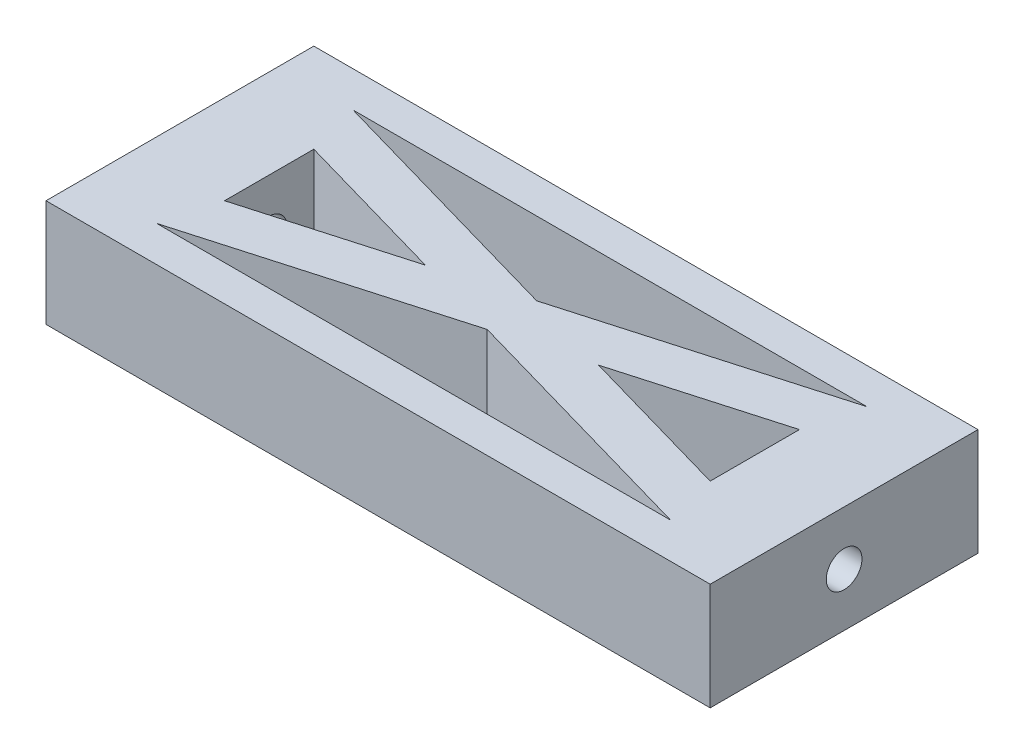
ISO-10303-21;
HEADER;
FILE_DESCRIPTION(('STEP AP214'),'2;1');
FILE_NAME('part.step','',(''),(''),'','','');
FILE_SCHEMA(('AUTOMOTIVE_DESIGN { 1 0 10303 214 1 1 1 1 }'));
ENDSEC;
DATA;
#1=APPLICATION_CONTEXT('core data for automotive mechanical design processes');
#2=APPLICATION_PROTOCOL_DEFINITION('international standard','automotive_design',2000,#1);
#3=PRODUCT_CONTEXT('',#1,'mechanical');
#4=PRODUCT('Part','Part','',(#3));
#5=PRODUCT_RELATED_PRODUCT_CATEGORY('part','',(#4));
#6=PRODUCT_DEFINITION_FORMATION('','',#4);
#7=PRODUCT_DEFINITION_CONTEXT('part definition',#1,'design');
#8=PRODUCT_DEFINITION('design','',#6,#7);
#9=PRODUCT_DEFINITION_SHAPE('','',#8);
#10=(LENGTH_UNIT() NAMED_UNIT(*) SI_UNIT(.MILLI.,.METRE.));
#11=(NAMED_UNIT(*) PLANE_ANGLE_UNIT() SI_UNIT($,.RADIAN.));
#12=(NAMED_UNIT(*) SI_UNIT($,.STERADIAN.) SOLID_ANGLE_UNIT());
#13=UNCERTAINTY_MEASURE_WITH_UNIT(LENGTH_MEASURE(1.E-05),#10,'distance_accuracy_value','');
#14=(GEOMETRIC_REPRESENTATION_CONTEXT(3) GLOBAL_UNCERTAINTY_ASSIGNED_CONTEXT((#13)) GLOBAL_UNIT_ASSIGNED_CONTEXT((#10,
#11,#12)) REPRESENTATION_CONTEXT('',''));
#15=CARTESIAN_POINT('',(0.,0.,0.));
#16=DIRECTION('',(0.,0.,1.));
#17=DIRECTION('',(1.,0.,0.));
#18=AXIS2_PLACEMENT_3D('',#15,#16,#17);
#19=CARTESIAN_POINT('',(0.,7.62,0.));
#20=DIRECTION('',(0.,1.,0.));
#21=DIRECTION('',(0.,0.,1.));
#22=AXIS2_PLACEMENT_3D('',#19,#20,#21);
#23=PLANE('',#22);
#24=DIRECTION('',(0.,0.,1.));
#25=VECTOR('',#24,1.);
#26=CARTESIAN_POINT('',(-23.622,7.62,9.52500000000001));
#27=LINE('',#26,#25);
#28=CARTESIAN_POINT('',(-23.622,7.62,-9.525));
#29=VERTEX_POINT('',#28);
#30=CARTESIAN_POINT('',(-23.622,7.62,9.52500000000001));
#31=VERTEX_POINT('',#30);
#32=EDGE_CURVE('E337',#29,#31,#27,.T.);
#33=ORIENTED_EDGE('',*,*,#32,.T.);
#34=DIRECTION('',(1.,0.,0.));
#35=VECTOR('',#34,1.);
#36=CARTESIAN_POINT('',(23.622,7.62,9.525));
#37=LINE('',#36,#35);
#38=CARTESIAN_POINT('',(23.622,7.62,9.525));
#39=VERTEX_POINT('',#38);
#40=EDGE_CURVE('E339',#31,#39,#37,.T.);
#41=ORIENTED_EDGE('',*,*,#40,.T.);
#42=DIRECTION('',(0.,0.,-1.));
#43=VECTOR('',#42,1.);
#44=CARTESIAN_POINT('',(23.622,7.62,9.525));
#45=LINE('',#44,#43);
#46=CARTESIAN_POINT('',(23.622,7.62,-9.525));
#47=VERTEX_POINT('',#46);
#48=EDGE_CURVE('E345',#39,#47,#45,.T.);
#49=ORIENTED_EDGE('',*,*,#48,.T.);
#50=DIRECTION('',(-1.,0.,0.));
#51=VECTOR('',#50,1.);
#52=CARTESIAN_POINT('',(23.622,7.62,-9.525));
#53=LINE('',#52,#51);
#54=EDGE_CURVE('E341',#47,#29,#53,.T.);
#55=ORIENTED_EDGE('',*,*,#54,.T.);
#56=EDGE_LOOP('',(#33,#41,#49,#55));
#57=FACE_BOUND('',#56,.T.);
#58=DIRECTION('',(-0.961474939175395,0.,-0.274892599641515));
#59=VECTOR('',#58,1.);
#60=CARTESIAN_POINT('',(-0.466014991757953,7.62,1.62995197557014));
#61=LINE('',#60,#59);
#62=CARTESIAN_POINT('',(-6.16699777053712,7.62,0.));
#63=VERTEX_POINT('',#62);
#64=CARTESIAN_POINT('',(-17.272,7.62,-3.17499999999999));
#65=VERTEX_POINT('',#64);
#66=EDGE_CURVE('E317',#63,#65,#61,.T.);
#67=ORIENTED_EDGE('',*,*,#66,.F.);
#68=DIRECTION('',(-0.961474939175395,0.,0.274892599641515));
#69=VECTOR('',#68,1.);
#70=CARTESIAN_POINT('',(-0.466014991757952,7.62,-1.62995197557014));
#71=LINE('',#70,#69);
#72=CARTESIAN_POINT('',(-17.272,7.62,3.175));
#73=VERTEX_POINT('',#72);
#74=EDGE_CURVE('E297',#63,#73,#71,.T.);
#75=ORIENTED_EDGE('',*,*,#74,.T.);
#76=DIRECTION('',(0.,0.,-1.));
#77=VECTOR('',#76,1.);
#78=CARTESIAN_POINT('',(-17.272,7.62,0.));
#79=LINE('',#78,#77);
#80=EDGE_CURVE('E310',#73,#65,#79,.T.);
#81=ORIENTED_EDGE('',*,*,#80,.T.);
#82=EDGE_LOOP('',(#67,#75,#81));
#83=FACE_BOUND('',#82,.T.);
#84=DIRECTION('',(-0.961474939175395,0.,0.274892599641515));
#85=VECTOR('',#84,1.);
#86=CARTESIAN_POINT('',(-0.466014991757952,7.62,-1.62995197557014));
#87=LINE('',#86,#85);
#88=CARTESIAN_POINT('',(18.2640071342813,7.62,-6.985));
#89=VERTEX_POINT('',#88);
#90=CARTESIAN_POINT('',(-0.00582880520858436,7.62,-1.76152251577389));
#91=VERTEX_POINT('',#90);
#92=EDGE_CURVE('E254',#89,#91,#87,.T.);
#93=ORIENTED_EDGE('',*,*,#92,.T.);
#94=DIRECTION('',(-0.961523947640823,0.,-0.274721127897378));
#95=VECTOR('',#94,1.);
#96=CARTESIAN_POINT('',(0.464867924528303,7.62,-1.62703773584906));
#97=LINE('',#96,#95);
#98=CARTESIAN_POINT('',(-18.288,7.62,-6.985));
#99=VERTEX_POINT('',#98);
#100=EDGE_CURVE('E246',#91,#99,#97,.T.);
#101=ORIENTED_EDGE('',*,*,#100,.T.);
#102=DIRECTION('',(1.,0.,0.));
#103=VECTOR('',#102,1.);
#104=CARTESIAN_POINT('',(0.,7.62,-6.985));
#105=LINE('',#104,#103);
#106=EDGE_CURVE('E249',#99,#89,#105,.T.);
#107=ORIENTED_EDGE('',*,*,#106,.T.);
#108=EDGE_LOOP('',(#93,#101,#107));
#109=FACE_BOUND('',#108,.T.);
#110=DIRECTION('',(-0.961523947640823,0.,-0.274721127897378));
#111=VECTOR('',#110,1.);
#112=CARTESIAN_POINT('',(0.464867924528303,7.62,-1.62703773584906));
#113=LINE('',#112,#111);
#114=CARTESIAN_POINT('',(17.272,7.62,3.175));
#115=VERTEX_POINT('',#114);
#116=CARTESIAN_POINT('',(6.15950000000002,7.62,0.));
#117=VERTEX_POINT('',#116);
#118=EDGE_CURVE('E291',#115,#117,#113,.T.);
#119=ORIENTED_EDGE('',*,*,#118,.T.);
#120=DIRECTION('',(0.961523947640823,0.,-0.274721127897378));
#121=VECTOR('',#120,1.);
#122=CARTESIAN_POINT('',(0.464867924528305,7.62,1.62703773584907));
#123=LINE('',#122,#121);
#124=CARTESIAN_POINT('',(17.272,7.62,-3.17499999999999));
#125=VERTEX_POINT('',#124);
#126=EDGE_CURVE('E132',#117,#125,#123,.T.);
#127=ORIENTED_EDGE('',*,*,#126,.T.);
#128=DIRECTION('',(0.,0.,1.));
#129=VECTOR('',#128,1.);
#130=CARTESIAN_POINT('',(17.272,7.62,0.));
#131=LINE('',#130,#129);
#132=EDGE_CURVE('E287',#125,#115,#131,.T.);
#133=ORIENTED_EDGE('',*,*,#132,.T.);
#134=EDGE_LOOP('',(#119,#127,#133));
#135=FACE_BOUND('',#134,.T.);
#136=DIRECTION('',(1.,0.,0.));
#137=VECTOR('',#136,1.);
#138=CARTESIAN_POINT('',(0.,7.62,6.98500000000001));
#139=LINE('',#138,#137);
#140=CARTESIAN_POINT('',(-18.288,7.62,6.985));
#141=VERTEX_POINT('',#140);
#142=CARTESIAN_POINT('',(18.2640071342813,7.62,6.98500000000001));
#143=VERTEX_POINT('',#142);
#144=EDGE_CURVE('E271',#141,#143,#139,.T.);
#145=ORIENTED_EDGE('',*,*,#144,.F.);
#146=DIRECTION('',(0.961523947640823,0.,-0.274721127897378));
#147=VECTOR('',#146,1.);
#148=CARTESIAN_POINT('',(0.464867924528305,7.62,1.62703773584907));
#149=LINE('',#148,#147);
#150=CARTESIAN_POINT('',(-0.00582880520857997,7.62,1.76152251577389));
#151=VERTEX_POINT('',#150);
#152=EDGE_CURVE('E130',#141,#151,#149,.T.);
#153=ORIENTED_EDGE('',*,*,#152,.T.);
#154=DIRECTION('',(-0.961474939175395,0.,-0.274892599641515));
#155=VECTOR('',#154,1.);
#156=CARTESIAN_POINT('',(-0.466014991757953,7.62,1.62995197557014));
#157=LINE('',#156,#155);
#158=EDGE_CURVE('E262',#143,#151,#157,.T.);
#159=ORIENTED_EDGE('',*,*,#158,.F.);
#160=EDGE_LOOP('',(#145,#153,#159));
#161=FACE_BOUND('',#160,.T.);
#162=ADVANCED_FACE('F109',(#57,#83,#109,#135,#161),#23,.T.);
#163=CARTESIAN_POINT('',(0.,0.,0.));
#164=DIRECTION('',(0.,1.,0.));
#165=DIRECTION('',(0.,0.,1.));
#166=AXIS2_PLACEMENT_3D('',#163,#164,#165);
#167=PLANE('',#166);
#168=DIRECTION('',(0.961523947640823,0.,-0.274721127897378));
#169=VECTOR('',#168,1.);
#170=CARTESIAN_POINT('',(0.464867924528305,0.,1.62703773584907));
#171=LINE('',#170,#169);
#172=CARTESIAN_POINT('',(6.15950000000002,0.,0.));
#173=VERTEX_POINT('',#172);
#174=CARTESIAN_POINT('',(17.272,0.,-3.17499999999999));
#175=VERTEX_POINT('',#174);
#176=EDGE_CURVE('E285',#173,#175,#171,.T.);
#177=ORIENTED_EDGE('',*,*,#176,.F.);
#178=DIRECTION('',(-0.961523947640823,0.,-0.274721127897378));
#179=VECTOR('',#178,1.);
#180=CARTESIAN_POINT('',(0.464867924528303,0.,-1.62703773584906));
#181=LINE('',#180,#179);
#182=CARTESIAN_POINT('',(17.272,0.,3.17499999999999));
#183=VERTEX_POINT('',#182);
#184=EDGE_CURVE('E282',#183,#173,#181,.T.);
#185=ORIENTED_EDGE('',*,*,#184,.F.);
#186=DIRECTION('',(0.,0.,1.));
#187=VECTOR('',#186,1.);
#188=CARTESIAN_POINT('',(17.272,0.,0.));
#189=LINE('',#188,#187);
#190=EDGE_CURVE('E288',#175,#183,#189,.T.);
#191=ORIENTED_EDGE('',*,*,#190,.F.);
#192=EDGE_LOOP('',(#177,#185,#191));
#193=FACE_BOUND('',#192,.T.);
#194=DIRECTION('',(-0.961474939175395,0.,0.274892599641515));
#195=VECTOR('',#194,1.);
#196=CARTESIAN_POINT('',(-0.466014991757952,0.,-1.62995197557014));
#197=LINE('',#196,#195);
#198=CARTESIAN_POINT('',(-6.16699777053712,0.,0.));
#199=VERTEX_POINT('',#198);
#200=CARTESIAN_POINT('',(-17.272,0.,3.175));
#201=VERTEX_POINT('',#200);
#202=EDGE_CURVE('E302',#199,#201,#197,.T.);
#203=ORIENTED_EDGE('',*,*,#202,.F.);
#204=DIRECTION('',(-0.961474939175395,0.,-0.274892599641515));
#205=VECTOR('',#204,1.);
#206=CARTESIAN_POINT('',(-0.466014991757953,0.,1.62995197557014));
#207=LINE('',#206,#205);
#208=CARTESIAN_POINT('',(-17.272,0.,-3.17499999999999));
#209=VERTEX_POINT('',#208);
#210=EDGE_CURVE('E306',#199,#209,#207,.T.);
#211=ORIENTED_EDGE('',*,*,#210,.T.);
#212=DIRECTION('',(0.,0.,-1.));
#213=VECTOR('',#212,1.);
#214=CARTESIAN_POINT('',(-17.272,0.,0.));
#215=LINE('',#214,#213);
#216=EDGE_CURVE('E309',#201,#209,#215,.T.);
#217=ORIENTED_EDGE('',*,*,#216,.F.);
#218=EDGE_LOOP('',(#203,#211,#217));
#219=FACE_BOUND('',#218,.T.);
#220=DIRECTION('',(0.,0.,1.));
#221=VECTOR('',#220,1.);
#222=CARTESIAN_POINT('',(-23.622,0.,9.52500000000001));
#223=LINE('',#222,#221);
#224=CARTESIAN_POINT('',(-23.622,0.,-9.525));
#225=VERTEX_POINT('',#224);
#226=CARTESIAN_POINT('',(-23.622,0.,9.52500000000001));
#227=VERTEX_POINT('',#226);
#228=EDGE_CURVE('E331',#225,#227,#223,.T.);
#229=ORIENTED_EDGE('',*,*,#228,.F.);
#230=DIRECTION('',(-1.,0.,0.));
#231=VECTOR('',#230,1.);
#232=CARTESIAN_POINT('',(23.622,0.,-9.525));
#233=LINE('',#232,#231);
#234=CARTESIAN_POINT('',(23.622,0.,-9.525));
#235=VERTEX_POINT('',#234);
#236=EDGE_CURVE('E338',#235,#225,#233,.T.);
#237=ORIENTED_EDGE('',*,*,#236,.F.);
#238=DIRECTION('',(0.,0.,-1.));
#239=VECTOR('',#238,1.);
#240=CARTESIAN_POINT('',(23.622,0.,9.525));
#241=LINE('',#240,#239);
#242=CARTESIAN_POINT('',(23.622,0.,9.525));
#243=VERTEX_POINT('',#242);
#244=EDGE_CURVE('E352',#243,#235,#241,.T.);
#245=ORIENTED_EDGE('',*,*,#244,.F.);
#246=DIRECTION('',(1.,0.,0.));
#247=VECTOR('',#246,1.);
#248=CARTESIAN_POINT('',(23.622,0.,9.525));
#249=LINE('',#248,#247);
#250=EDGE_CURVE('E348',#227,#243,#249,.T.);
#251=ORIENTED_EDGE('',*,*,#250,.F.);
#252=EDGE_LOOP('',(#229,#237,#245,#251));
#253=FACE_BOUND('',#252,.T.);
#254=DIRECTION('',(-0.961523947640823,0.,-0.274721127897378));
#255=VECTOR('',#254,1.);
#256=CARTESIAN_POINT('',(0.464867924528303,0.,-1.62703773584906));
#257=LINE('',#256,#255);
#258=CARTESIAN_POINT('',(-0.00582880520858442,0.,-1.76152251577389));
#259=VERTEX_POINT('',#258);
#260=CARTESIAN_POINT('',(-18.288,0.,-6.985));
#261=VERTEX_POINT('',#260);
#262=EDGE_CURVE('E237',#259,#261,#257,.T.);
#263=ORIENTED_EDGE('',*,*,#262,.F.);
#264=DIRECTION('',(-0.961474939175395,0.,0.274892599641515));
#265=VECTOR('',#264,1.);
#266=CARTESIAN_POINT('',(-0.466014991757952,0.,-1.62995197557014));
#267=LINE('',#266,#265);
#268=CARTESIAN_POINT('',(18.2640071342813,0.,-6.985));
#269=VERTEX_POINT('',#268);
#270=EDGE_CURVE('E227',#269,#259,#267,.T.);
#271=ORIENTED_EDGE('',*,*,#270,.F.);
#272=DIRECTION('',(1.,0.,0.));
#273=VECTOR('',#272,1.);
#274=CARTESIAN_POINT('',(0.,0.,-6.985));
#275=LINE('',#274,#273);
#276=EDGE_CURVE('E238',#261,#269,#275,.T.);
#277=ORIENTED_EDGE('',*,*,#276,.F.);
#278=EDGE_LOOP('',(#263,#271,#277));
#279=FACE_BOUND('',#278,.T.);
#280=DIRECTION('',(0.961523947640823,0.,-0.274721127897378));
#281=VECTOR('',#280,1.);
#282=CARTESIAN_POINT('',(0.464867924528305,0.,1.62703773584907));
#283=LINE('',#282,#281);
#284=CARTESIAN_POINT('',(-18.288,0.,6.98500000000002));
#285=VERTEX_POINT('',#284);
#286=CARTESIAN_POINT('',(-0.00582880520857997,0.,1.76152251577389));
#287=VERTEX_POINT('',#286);
#288=EDGE_CURVE('E261',#285,#287,#283,.T.);
#289=ORIENTED_EDGE('',*,*,#288,.F.);
#290=DIRECTION('',(1.,0.,0.));
#291=VECTOR('',#290,1.);
#292=CARTESIAN_POINT('',(0.,0.,6.98500000000001));
#293=LINE('',#292,#291);
#294=CARTESIAN_POINT('',(18.2640071342813,0.,6.98500000000001));
#295=VERTEX_POINT('',#294);
#296=EDGE_CURVE('E263',#285,#295,#293,.T.);
#297=ORIENTED_EDGE('',*,*,#296,.T.);
#298=DIRECTION('',(-0.961474939175395,0.,-0.274892599641515));
#299=VECTOR('',#298,1.);
#300=CARTESIAN_POINT('',(-0.466014991757953,0.,1.62995197557014));
#301=LINE('',#300,#299);
#302=EDGE_CURVE('E268',#295,#287,#301,.T.);
#303=ORIENTED_EDGE('',*,*,#302,.T.);
#304=EDGE_LOOP('',(#289,#297,#303));
#305=FACE_BOUND('',#304,.T.);
#306=ADVANCED_FACE('F247',(#193,#219,#253,#279,#305),#167,.F.);
#307=CARTESIAN_POINT('',(16.002,3.78692589120411,0.));
#308=DIRECTION('',(1.,0.,0.));
#309=DIRECTION('',(0.,0.,-1.));
#310=AXIS2_PLACEMENT_3D('',#307,#308,#309);
#311=CYLINDRICAL_SURFACE('',#310,1.27);
#312=CARTESIAN_POINT('',(23.622,3.78692589120411,0.));
#313=DIRECTION('',(1.,0.,0.));
#314=DIRECTION('',(0.,0.,-1.));
#315=AXIS2_PLACEMENT_3D('',#312,#313,#314);
#316=CIRCLE('',#315,1.27);
#317=CARTESIAN_POINT('',(23.622,3.78692589120411,-1.27));
#318=VERTEX_POINT('',#317);
#319=EDGE_CURVE('E335',#318,#318,#316,.T.);
#320=CARTESIAN_POINT('',(17.272,3.78692589120411,0.));
#321=DIRECTION('',(-1.,0.,0.));
#322=DIRECTION('',(0.,0.,1.));
#323=AXIS2_PLACEMENT_3D('',#320,#321,#322);
#324=CIRCLE('',#323,1.27);
#325=CARTESIAN_POINT('',(17.272,3.78692589120411,-1.27));
#326=VERTEX_POINT('',#325);
#327=EDGE_CURVE('E112',#326,#326,#324,.F.);
#328=CARTESIAN_POINT('',(23.622,3.78692589120411,-1.27));
#329=CARTESIAN_POINT('',(23.5558541666667,3.78692589120411,-1.27));
#330=CARTESIAN_POINT('',(23.4897083333333,3.78692589120411,-1.27));
#331=CARTESIAN_POINT('',(23.3574166666667,3.78692589120411,-1.27));
#332=CARTESIAN_POINT('',(23.2912708333333,3.78692589120411,-1.27));
#333=CARTESIAN_POINT('',(23.1589791666667,3.78692589120411,-1.27));
#334=CARTESIAN_POINT('',(23.0928333333333,3.78692589120411,-1.27));
#335=CARTESIAN_POINT('',(22.9605416666667,3.78692589120411,-1.27));
#336=CARTESIAN_POINT('',(22.8943958333333,3.78692589120411,-1.27));
#337=CARTESIAN_POINT('',(22.7621041666667,3.78692589120411,-1.27));
#338=CARTESIAN_POINT('',(22.6959583333333,3.78692589120411,-1.27));
#339=CARTESIAN_POINT('',(22.5636666666667,3.78692589120411,-1.27));
#340=CARTESIAN_POINT('',(22.4975208333333,3.78692589120411,-1.27));
#341=CARTESIAN_POINT('',(22.3652291666667,3.78692589120411,-1.27));
#342=CARTESIAN_POINT('',(22.2990833333333,3.78692589120411,-1.27));
#343=CARTESIAN_POINT('',(22.1667916666667,3.78692589120411,-1.27));
#344=CARTESIAN_POINT('',(22.1006458333333,3.78692589120411,-1.27));
#345=CARTESIAN_POINT('',(21.9683541666667,3.78692589120411,-1.27));
#346=CARTESIAN_POINT('',(21.9022083333333,3.78692589120411,-1.27));
#347=CARTESIAN_POINT('',(21.7699166666667,3.78692589120411,-1.27));
#348=CARTESIAN_POINT('',(21.7037708333333,3.78692589120411,-1.27));
#349=CARTESIAN_POINT('',(21.5714791666667,3.78692589120411,-1.27));
#350=CARTESIAN_POINT('',(21.5053333333333,3.78692589120411,-1.27));
#351=CARTESIAN_POINT('',(21.3730416666667,3.78692589120411,-1.27));
#352=CARTESIAN_POINT('',(21.3068958333333,3.78692589120411,-1.27));
#353=CARTESIAN_POINT('',(21.1746041666667,3.78692589120411,-1.27));
#354=CARTESIAN_POINT('',(21.1084583333333,3.78692589120411,-1.27));
#355=CARTESIAN_POINT('',(20.9761666666667,3.78692589120411,-1.27));
#356=CARTESIAN_POINT('',(20.9100208333333,3.78692589120411,-1.27));
#357=CARTESIAN_POINT('',(20.7777291666667,3.78692589120411,-1.27));
#358=CARTESIAN_POINT('',(20.7115833333333,3.78692589120411,-1.27));
#359=CARTESIAN_POINT('',(20.5792916666667,3.78692589120411,-1.27));
#360=CARTESIAN_POINT('',(20.5131458333333,3.78692589120411,-1.27));
#361=CARTESIAN_POINT('',(20.3808541666667,3.78692589120411,-1.27));
#362=CARTESIAN_POINT('',(20.3147083333333,3.78692589120411,-1.27));
#363=CARTESIAN_POINT('',(20.1824166666667,3.78692589120411,-1.27));
#364=CARTESIAN_POINT('',(20.1162708333333,3.78692589120411,-1.27));
#365=CARTESIAN_POINT('',(19.9839791666667,3.78692589120411,-1.27));
#366=CARTESIAN_POINT('',(19.9178333333333,3.78692589120411,-1.27));
#367=CARTESIAN_POINT('',(19.7855416666667,3.78692589120411,-1.27));
#368=CARTESIAN_POINT('',(19.7193958333333,3.78692589120411,-1.27));
#369=CARTESIAN_POINT('',(19.5871041666667,3.78692589120411,-1.27));
#370=CARTESIAN_POINT('',(19.5209583333333,3.78692589120411,-1.27));
#371=CARTESIAN_POINT('',(19.3886666666667,3.78692589120411,-1.27));
#372=CARTESIAN_POINT('',(19.3225208333333,3.78692589120411,-1.27));
#373=CARTESIAN_POINT('',(19.1902291666667,3.78692589120411,-1.27));
#374=CARTESIAN_POINT('',(19.1240833333333,3.78692589120411,-1.27));
#375=CARTESIAN_POINT('',(18.9917916666667,3.78692589120411,-1.27));
#376=CARTESIAN_POINT('',(18.9256458333333,3.78692589120411,-1.27));
#377=CARTESIAN_POINT('',(18.7933541666667,3.78692589120411,-1.27));
#378=CARTESIAN_POINT('',(18.7272083333333,3.78692589120411,-1.27));
#379=CARTESIAN_POINT('',(18.5949166666667,3.78692589120411,-1.27));
#380=CARTESIAN_POINT('',(18.5287708333333,3.78692589120411,-1.27));
#381=CARTESIAN_POINT('',(18.3964791666667,3.78692589120411,-1.27));
#382=CARTESIAN_POINT('',(18.3303333333333,3.78692589120411,-1.27));
#383=CARTESIAN_POINT('',(18.1980416666667,3.78692589120411,-1.27));
#384=CARTESIAN_POINT('',(18.1318958333333,3.78692589120411,-1.27));
#385=CARTESIAN_POINT('',(17.9996041666667,3.78692589120411,-1.27));
#386=CARTESIAN_POINT('',(17.9334583333333,3.78692589120411,-1.27));
#387=CARTESIAN_POINT('',(17.8011666666667,3.78692589120411,-1.27));
#388=CARTESIAN_POINT('',(17.7350208333333,3.78692589120411,-1.27));
#389=CARTESIAN_POINT('',(17.6027291666667,3.78692589120411,-1.27));
#390=CARTESIAN_POINT('',(17.5365833333333,3.78692589120411,-1.27));
#391=CARTESIAN_POINT('',(17.4042916666667,3.78692589120411,-1.27));
#392=CARTESIAN_POINT('',(17.3381458333333,3.78692589120411,-1.27));
#393=CARTESIAN_POINT('',(17.272,3.78692589120411,-1.27));
#394=B_SPLINE_CURVE_WITH_KNOTS('',3,(#328,#329,#330,#331,#332,#333,#334,#335,#336,#337,#338,
#339,#340,#341,#342,#343,#344,#345,#346,#347,#348,#349,#350,#351,#352,#353,#354,#355,#356,#357,
#358,#359,#360,#361,#362,#363,#364,#365,#366,#367,#368,#369,#370,#371,#372,#373,#374,#375,#376,
#377,#378,#379,#380,#381,#382,#383,#384,#385,#386,#387,#388,#389,#390,#391,#392,#393),
.UNSPECIFIED.,.F.,.F.,(4,2,2,2,2,2,2,2,2,2,2,2,2,2,2,2,2,2,2,2,2,2,2,2,2,2,2,2,2,2,2,2,4),(0.,
0.198437499999999,0.396874999999998,0.595312499999997,0.793749999999999,0.992187499999998,
1.190625,1.3890625,1.5875,1.7859375,1.984375,2.1828125,2.38125,2.5796875,2.778125,2.9765625,
3.175,3.3734375,3.571875,3.7703125,3.96875,4.1671875,4.365625,4.5640625,4.7625,4.9609375,
5.159375,5.3578125,5.55625,5.7546875,5.953125,6.1515625,6.35),.UNSPECIFIED.);
#395=EDGE_CURVE('BSEAM368',#318,#326,#394,.T.);
#396=ORIENTED_EDGE('',*,*,#319,.T.);
#397=ORIENTED_EDGE('',*,*,#327,.F.);
#398=ORIENTED_EDGE('',*,*,#395,.T.);
#399=ORIENTED_EDGE('',*,*,#395,.F.);
#400=EDGE_LOOP('',(#396,#398,#397,#399));
#401=FACE_BOUND('',#400,.T.);
#402=ADVANCED_FACE('F368',(#401),#311,.F.);
#403=CARTESIAN_POINT('',(-16.002,3.81,0.));
#404=DIRECTION('',(-1.,0.,0.));
#405=DIRECTION('',(0.,0.,1.));
#406=AXIS2_PLACEMENT_3D('',#403,#404,#405);
#407=CYLINDRICAL_SURFACE('',#406,1.27);
#408=CARTESIAN_POINT('',(-23.622,3.81,0.));
#409=DIRECTION('',(-1.,0.,0.));
#410=DIRECTION('',(0.,0.,1.));
#411=AXIS2_PLACEMENT_3D('',#408,#409,#410);
#412=CIRCLE('',#411,1.27);
#413=CARTESIAN_POINT('',(-23.622,3.81,1.27));
#414=VERTEX_POINT('',#413);
#415=EDGE_CURVE('E328',#414,#414,#412,.T.);
#416=CARTESIAN_POINT('',(-17.272,3.81,0.));
#417=DIRECTION('',(1.,0.,0.));
#418=DIRECTION('',(0.,0.,-1.));
#419=AXIS2_PLACEMENT_3D('',#416,#417,#418);
#420=CIRCLE('',#419,1.27);
#421=CARTESIAN_POINT('',(-17.272,3.81,1.27));
#422=VERTEX_POINT('',#421);
#423=EDGE_CURVE('E321',#422,#422,#420,.F.);
#424=CARTESIAN_POINT('',(-23.622,3.81,1.27));
#425=CARTESIAN_POINT('',(-23.5558541666667,3.81,1.27));
#426=CARTESIAN_POINT('',(-23.4897083333333,3.81,1.27));
#427=CARTESIAN_POINT('',(-23.3574166666667,3.81,1.27));
#428=CARTESIAN_POINT('',(-23.2912708333333,3.81,1.27));
#429=CARTESIAN_POINT('',(-23.1589791666667,3.81,1.27));
#430=CARTESIAN_POINT('',(-23.0928333333333,3.81,1.27));
#431=CARTESIAN_POINT('',(-22.9605416666667,3.81,1.27));
#432=CARTESIAN_POINT('',(-22.8943958333333,3.81,1.27));
#433=CARTESIAN_POINT('',(-22.7621041666667,3.81,1.27));
#434=CARTESIAN_POINT('',(-22.6959583333333,3.81,1.27));
#435=CARTESIAN_POINT('',(-22.5636666666667,3.81,1.27));
#436=CARTESIAN_POINT('',(-22.4975208333333,3.81,1.27));
#437=CARTESIAN_POINT('',(-22.3652291666667,3.81,1.27));
#438=CARTESIAN_POINT('',(-22.2990833333333,3.81,1.27));
#439=CARTESIAN_POINT('',(-22.1667916666667,3.81,1.27));
#440=CARTESIAN_POINT('',(-22.1006458333333,3.81,1.27));
#441=CARTESIAN_POINT('',(-21.9683541666667,3.81,1.27));
#442=CARTESIAN_POINT('',(-21.9022083333333,3.81,1.27));
#443=CARTESIAN_POINT('',(-21.7699166666667,3.81,1.27));
#444=CARTESIAN_POINT('',(-21.7037708333333,3.81,1.27));
#445=CARTESIAN_POINT('',(-21.5714791666667,3.81,1.27));
#446=CARTESIAN_POINT('',(-21.5053333333333,3.81,1.27));
#447=CARTESIAN_POINT('',(-21.3730416666667,3.81,1.27));
#448=CARTESIAN_POINT('',(-21.3068958333333,3.81,1.27));
#449=CARTESIAN_POINT('',(-21.1746041666667,3.81,1.27));
#450=CARTESIAN_POINT('',(-21.1084583333333,3.81,1.27));
#451=CARTESIAN_POINT('',(-20.9761666666667,3.81,1.27));
#452=CARTESIAN_POINT('',(-20.9100208333333,3.81,1.27));
#453=CARTESIAN_POINT('',(-20.7777291666667,3.81,1.27));
#454=CARTESIAN_POINT('',(-20.7115833333333,3.81,1.27));
#455=CARTESIAN_POINT('',(-20.5792916666667,3.81,1.27));
#456=CARTESIAN_POINT('',(-20.5131458333333,3.81,1.27));
#457=CARTESIAN_POINT('',(-20.3808541666667,3.81,1.27));
#458=CARTESIAN_POINT('',(-20.3147083333333,3.81,1.27));
#459=CARTESIAN_POINT('',(-20.1824166666667,3.81,1.27));
#460=CARTESIAN_POINT('',(-20.1162708333333,3.81,1.27));
#461=CARTESIAN_POINT('',(-19.9839791666667,3.81,1.27));
#462=CARTESIAN_POINT('',(-19.9178333333333,3.81,1.27));
#463=CARTESIAN_POINT('',(-19.7855416666667,3.81,1.27));
#464=CARTESIAN_POINT('',(-19.7193958333333,3.81,1.27));
#465=CARTESIAN_POINT('',(-19.5871041666667,3.81,1.27));
#466=CARTESIAN_POINT('',(-19.5209583333333,3.81,1.27));
#467=CARTESIAN_POINT('',(-19.3886666666667,3.81,1.27));
#468=CARTESIAN_POINT('',(-19.3225208333333,3.81,1.27));
#469=CARTESIAN_POINT('',(-19.1902291666667,3.81,1.27));
#470=CARTESIAN_POINT('',(-19.1240833333333,3.81,1.27));
#471=CARTESIAN_POINT('',(-18.9917916666667,3.81,1.27));
#472=CARTESIAN_POINT('',(-18.9256458333333,3.81,1.27));
#473=CARTESIAN_POINT('',(-18.7933541666667,3.81,1.27));
#474=CARTESIAN_POINT('',(-18.7272083333333,3.81,1.27));
#475=CARTESIAN_POINT('',(-18.5949166666667,3.81,1.27));
#476=CARTESIAN_POINT('',(-18.5287708333333,3.81,1.27));
#477=CARTESIAN_POINT('',(-18.3964791666667,3.81,1.27));
#478=CARTESIAN_POINT('',(-18.3303333333333,3.81,1.27));
#479=CARTESIAN_POINT('',(-18.1980416666667,3.81,1.27));
#480=CARTESIAN_POINT('',(-18.1318958333333,3.81,1.27));
#481=CARTESIAN_POINT('',(-17.9996041666667,3.81,1.27));
#482=CARTESIAN_POINT('',(-17.9334583333333,3.81,1.27));
#483=CARTESIAN_POINT('',(-17.8011666666667,3.81,1.27));
#484=CARTESIAN_POINT('',(-17.7350208333333,3.81,1.27));
#485=CARTESIAN_POINT('',(-17.6027291666667,3.81,1.27));
#486=CARTESIAN_POINT('',(-17.5365833333333,3.81,1.27));
#487=CARTESIAN_POINT('',(-17.4042916666667,3.81,1.27));
#488=CARTESIAN_POINT('',(-17.3381458333333,3.81,1.27));
#489=CARTESIAN_POINT('',(-17.272,3.81,1.27));
#490=B_SPLINE_CURVE_WITH_KNOTS('',3,(#424,#425,#426,#427,#428,#429,#430,#431,#432,#433,#434,
#435,#436,#437,#438,#439,#440,#441,#442,#443,#444,#445,#446,#447,#448,#449,#450,#451,#452,#453,
#454,#455,#456,#457,#458,#459,#460,#461,#462,#463,#464,#465,#466,#467,#468,#469,#470,#471,#472,
#473,#474,#475,#476,#477,#478,#479,#480,#481,#482,#483,#484,#485,#486,#487,#488,#489),
.UNSPECIFIED.,.F.,.F.,(4,2,2,2,2,2,2,2,2,2,2,2,2,2,2,2,2,2,2,2,2,2,2,2,2,2,2,2,2,2,2,2,4),(0.,
0.198437499999999,0.396874999999998,0.595312499999997,0.793749999999999,0.992187499999998,
1.190625,1.3890625,1.5875,1.7859375,1.984375,2.1828125,2.38125,2.5796875,2.778125,2.9765625,
3.175,3.3734375,3.571875,3.7703125,3.96875,4.1671875,4.365625,4.5640625,4.7625,4.9609375,
5.159375,5.3578125,5.55625,5.7546875,5.953125,6.1515625,6.35),.UNSPECIFIED.);
#491=EDGE_CURVE('BSEAM369',#414,#422,#490,.T.);
#492=ORIENTED_EDGE('',*,*,#415,.T.);
#493=ORIENTED_EDGE('',*,*,#423,.F.);
#494=ORIENTED_EDGE('',*,*,#491,.T.);
#495=ORIENTED_EDGE('',*,*,#491,.F.);
#496=EDGE_LOOP('',(#492,#494,#493,#495));
#497=FACE_BOUND('',#496,.T.);
#498=ADVANCED_FACE('F369',(#497),#407,.F.);
#499=CARTESIAN_POINT('',(-23.622,7.62,9.52500000000001));
#500=DIRECTION('',(1.,0.,0.));
#501=DIRECTION('',(0.,0.,-1.));
#502=AXIS2_PLACEMENT_3D('',#499,#500,#501);
#503=PLANE('',#502);
#504=ORIENTED_EDGE('',*,*,#415,.F.);
#505=EDGE_LOOP('',(#504));
#506=FACE_BOUND('',#505,.T.);
#507=ORIENTED_EDGE('',*,*,#228,.T.);
#508=DIRECTION('',(0.,-1.,0.));
#509=VECTOR('',#508,1.);
#510=CARTESIAN_POINT('',(-23.622,7.62,9.52500000000001));
#511=LINE('',#510,#509);
#512=EDGE_CURVE('E12',#31,#227,#511,.T.);
#513=ORIENTED_EDGE('',*,*,#512,.F.);
#514=ORIENTED_EDGE('',*,*,#32,.F.);
#515=DIRECTION('',(0.,-1.,0.));
#516=VECTOR('',#515,1.);
#517=CARTESIAN_POINT('',(-23.622,7.62,-9.525));
#518=LINE('',#517,#516);
#519=EDGE_CURVE('E349',#29,#225,#518,.T.);
#520=ORIENTED_EDGE('',*,*,#519,.T.);
#521=EDGE_LOOP('',(#507,#513,#514,#520));
#522=FACE_BOUND('',#521,.T.);
#523=ADVANCED_FACE('F115',(#506,#522),#503,.F.);
#524=CARTESIAN_POINT('',(23.622,7.62,9.525));
#525=DIRECTION('',(0.,0.,-1.));
#526=DIRECTION('',(-1.,0.,0.));
#527=AXIS2_PLACEMENT_3D('',#524,#525,#526);
#528=PLANE('',#527);
#529=ORIENTED_EDGE('',*,*,#250,.T.);
#530=DIRECTION('',(0.,-1.,0.));
#531=VECTOR('',#530,1.);
#532=CARTESIAN_POINT('',(23.622,7.62,9.525));
#533=LINE('',#532,#531);
#534=EDGE_CURVE('E118',#39,#243,#533,.T.);
#535=ORIENTED_EDGE('',*,*,#534,.F.);
#536=ORIENTED_EDGE('',*,*,#40,.F.);
#537=ORIENTED_EDGE('',*,*,#512,.T.);
#538=EDGE_LOOP('',(#529,#535,#536,#537));
#539=FACE_BOUND('',#538,.T.);
#540=ADVANCED_FACE('F397',(#539),#528,.F.);
#541=CARTESIAN_POINT('',(23.622,7.62,9.525));
#542=DIRECTION('',(-1.,0.,0.));
#543=DIRECTION('',(0.,0.,1.));
#544=AXIS2_PLACEMENT_3D('',#541,#542,#543);
#545=PLANE('',#544);
#546=ORIENTED_EDGE('',*,*,#319,.F.);
#547=EDGE_LOOP('',(#546));
#548=FACE_BOUND('',#547,.T.);
#549=ORIENTED_EDGE('',*,*,#244,.T.);
#550=DIRECTION('',(0.,-1.,0.));
#551=VECTOR('',#550,1.);
#552=CARTESIAN_POINT('',(23.622,7.62,-9.525));
#553=LINE('',#552,#551);
#554=EDGE_CURVE('E358',#47,#235,#553,.T.);
#555=ORIENTED_EDGE('',*,*,#554,.F.);
#556=ORIENTED_EDGE('',*,*,#48,.F.);
#557=ORIENTED_EDGE('',*,*,#534,.T.);
#558=EDGE_LOOP('',(#549,#555,#556,#557));
#559=FACE_BOUND('',#558,.T.);
#560=ADVANCED_FACE('F395',(#548,#559),#545,.F.);
#561=CARTESIAN_POINT('',(23.622,7.62,-9.525));
#562=DIRECTION('',(0.,0.,1.));
#563=DIRECTION('',(1.,0.,0.));
#564=AXIS2_PLACEMENT_3D('',#561,#562,#563);
#565=PLANE('',#564);
#566=ORIENTED_EDGE('',*,*,#236,.T.);
#567=ORIENTED_EDGE('',*,*,#519,.F.);
#568=ORIENTED_EDGE('',*,*,#54,.F.);
#569=ORIENTED_EDGE('',*,*,#554,.T.);
#570=EDGE_LOOP('',(#566,#567,#568,#569));
#571=FACE_BOUND('',#570,.T.);
#572=ADVANCED_FACE('F386',(#571),#565,.F.);
#573=CARTESIAN_POINT('',(-17.272,0.,0.));
#574=DIRECTION('',(1.,0.,0.));
#575=DIRECTION('',(0.,0.,-1.));
#576=AXIS2_PLACEMENT_3D('',#573,#574,#575);
#577=PLANE('',#576);
#578=ORIENTED_EDGE('',*,*,#80,.F.);
#579=DIRECTION('',(0.,1.,0.));
#580=VECTOR('',#579,1.);
#581=CARTESIAN_POINT('',(-17.272,0.,3.175));
#582=LINE('',#581,#580);
#583=EDGE_CURVE('E322',#201,#73,#582,.T.);
#584=ORIENTED_EDGE('',*,*,#583,.F.);
#585=ORIENTED_EDGE('',*,*,#216,.T.);
#586=DIRECTION('',(0.,1.,0.));
#587=VECTOR('',#586,1.);
#588=CARTESIAN_POINT('',(-17.272,0.,-3.17499999999999));
#589=LINE('',#588,#587);
#590=EDGE_CURVE('E323',#209,#65,#589,.T.);
#591=ORIENTED_EDGE('',*,*,#590,.T.);
#592=EDGE_LOOP('',(#578,#584,#585,#591));
#593=FACE_BOUND('',#592,.T.);
#594=ORIENTED_EDGE('',*,*,#423,.T.);
#595=EDGE_LOOP('',(#594));
#596=FACE_BOUND('',#595,.T.);
#597=ADVANCED_FACE('F391',(#593,#596),#577,.T.);
#598=CARTESIAN_POINT('',(-0.466014991757952,0.,-1.62995197557014));
#599=DIRECTION('',(-0.274892599641515,0.,-0.961474939175395));
#600=DIRECTION('',(-0.961474939175395,0.,0.274892599641515));
#601=AXIS2_PLACEMENT_3D('',#598,#599,#600);
#602=PLANE('',#601);
#603=ORIENTED_EDGE('',*,*,#74,.F.);
#604=DIRECTION('',(0.,1.,0.));
#605=VECTOR('',#604,1.);
#606=CARTESIAN_POINT('',(-6.16699777053712,0.,0.));
#607=LINE('',#606,#605);
#608=EDGE_CURVE('E312',#199,#63,#607,.T.);
#609=ORIENTED_EDGE('',*,*,#608,.F.);
#610=ORIENTED_EDGE('',*,*,#202,.T.);
#611=ORIENTED_EDGE('',*,*,#583,.T.);
#612=EDGE_LOOP('',(#603,#609,#610,#611));
#613=FACE_BOUND('',#612,.T.);
#614=ADVANCED_FACE('F458',(#613),#602,.T.);
#615=CARTESIAN_POINT('',(-0.466014991757953,0.,1.62995197557014));
#616=DIRECTION('',(0.274892599641515,0.,-0.961474939175395));
#617=DIRECTION('',(-0.961474939175395,0.,-0.274892599641515));
#618=AXIS2_PLACEMENT_3D('',#615,#616,#617);
#619=PLANE('',#618);
#620=ORIENTED_EDGE('',*,*,#66,.T.);
#621=ORIENTED_EDGE('',*,*,#590,.F.);
#622=ORIENTED_EDGE('',*,*,#210,.F.);
#623=ORIENTED_EDGE('',*,*,#608,.T.);
#624=EDGE_LOOP('',(#620,#621,#622,#623));
#625=FACE_BOUND('',#624,.T.);
#626=ADVANCED_FACE('F475',(#625),#619,.F.);
#627=CARTESIAN_POINT('',(17.272,0.,0.));
#628=DIRECTION('',(-1.,0.,0.));
#629=DIRECTION('',(0.,0.,1.));
#630=AXIS2_PLACEMENT_3D('',#627,#628,#629);
#631=PLANE('',#630);
#632=ORIENTED_EDGE('',*,*,#132,.F.);
#633=DIRECTION('',(0.,1.,0.));
#634=VECTOR('',#633,1.);
#635=CARTESIAN_POINT('',(17.272,0.,-3.17499999999999));
#636=LINE('',#635,#634);
#637=EDGE_CURVE('E296',#175,#125,#636,.T.);
#638=ORIENTED_EDGE('',*,*,#637,.F.);
#639=ORIENTED_EDGE('',*,*,#190,.T.);
#640=DIRECTION('',(0.,1.,0.));
#641=VECTOR('',#640,1.);
#642=CARTESIAN_POINT('',(17.272,0.,3.175));
#643=LINE('',#642,#641);
#644=EDGE_CURVE('E301',#183,#115,#643,.T.);
#645=ORIENTED_EDGE('',*,*,#644,.T.);
#646=EDGE_LOOP('',(#632,#638,#639,#645));
#647=FACE_BOUND('',#646,.T.);
#648=ORIENTED_EDGE('',*,*,#327,.T.);
#649=EDGE_LOOP('',(#648));
#650=FACE_BOUND('',#649,.T.);
#651=ADVANCED_FACE('F366',(#647,#650),#631,.T.);
#652=CARTESIAN_POINT('',(0.464867924528305,0.,1.62703773584907));
#653=DIRECTION('',(0.274721127897378,0.,0.961523947640823));
#654=DIRECTION('',(0.961523947640823,0.,-0.274721127897378));
#655=AXIS2_PLACEMENT_3D('',#652,#653,#654);
#656=PLANE('',#655);
#657=ORIENTED_EDGE('',*,*,#126,.F.);
#658=DIRECTION('',(0.,1.,0.));
#659=VECTOR('',#658,1.);
#660=CARTESIAN_POINT('',(6.15950000000002,0.,0.));
#661=LINE('',#660,#659);
#662=EDGE_CURVE('E293',#173,#117,#661,.T.);
#663=ORIENTED_EDGE('',*,*,#662,.F.);
#664=ORIENTED_EDGE('',*,*,#176,.T.);
#665=ORIENTED_EDGE('',*,*,#637,.T.);
#666=EDGE_LOOP('',(#657,#663,#664,#665));
#667=FACE_BOUND('',#666,.T.);
#668=ADVANCED_FACE('F493',(#667),#656,.T.);
#669=CARTESIAN_POINT('',(0.464867924528303,0.,-1.62703773584906));
#670=DIRECTION('',(0.274721127897378,0.,-0.961523947640823));
#671=DIRECTION('',(-0.961523947640823,0.,-0.274721127897378));
#672=AXIS2_PLACEMENT_3D('',#669,#670,#671);
#673=PLANE('',#672);
#674=ORIENTED_EDGE('',*,*,#118,.F.);
#675=ORIENTED_EDGE('',*,*,#644,.F.);
#676=ORIENTED_EDGE('',*,*,#184,.T.);
#677=ORIENTED_EDGE('',*,*,#662,.T.);
#678=EDGE_LOOP('',(#674,#675,#676,#677));
#679=FACE_BOUND('',#678,.T.);
#680=ADVANCED_FACE('F502',(#679),#673,.T.);
#681=CARTESIAN_POINT('',(0.464867924528303,0.,-1.62703773584906));
#682=DIRECTION('',(0.274721127897378,0.,-0.961523947640823));
#683=DIRECTION('',(-0.961523947640823,0.,-0.274721127897378));
#684=AXIS2_PLACEMENT_3D('',#681,#682,#683);
#685=PLANE('',#684);
#686=ORIENTED_EDGE('',*,*,#100,.F.);
#687=DIRECTION('',(0.,1.,0.));
#688=VECTOR('',#687,1.);
#689=CARTESIAN_POINT('',(-0.00582880520858442,0.,-1.76152251577389));
#690=LINE('',#689,#688);
#691=EDGE_CURVE('E233',#259,#91,#690,.T.);
#692=ORIENTED_EDGE('',*,*,#691,.F.);
#693=ORIENTED_EDGE('',*,*,#262,.T.);
#694=DIRECTION('',(0.,1.,0.));
#695=VECTOR('',#694,1.);
#696=CARTESIAN_POINT('',(-18.288,0.,-6.985));
#697=LINE('',#696,#695);
#698=EDGE_CURVE('E256',#261,#99,#697,.T.);
#699=ORIENTED_EDGE('',*,*,#698,.T.);
#700=EDGE_LOOP('',(#686,#692,#693,#699));
#701=FACE_BOUND('',#700,.T.);
#702=ADVANCED_FACE('F245',(#701),#685,.T.);
#703=CARTESIAN_POINT('',(0.,0.,-6.985));
#704=DIRECTION('',(0.,0.,1.));
#705=DIRECTION('',(1.,0.,0.));
#706=AXIS2_PLACEMENT_3D('',#703,#704,#705);
#707=PLANE('',#706);
#708=ORIENTED_EDGE('',*,*,#106,.F.);
#709=ORIENTED_EDGE('',*,*,#698,.F.);
#710=ORIENTED_EDGE('',*,*,#276,.T.);
#711=DIRECTION('',(0.,1.,0.));
#712=VECTOR('',#711,1.);
#713=CARTESIAN_POINT('',(18.2640071342813,0.,-6.985));
#714=LINE('',#713,#712);
#715=EDGE_CURVE('E231',#269,#89,#714,.T.);
#716=ORIENTED_EDGE('',*,*,#715,.T.);
#717=EDGE_LOOP('',(#708,#709,#710,#716));
#718=FACE_BOUND('',#717,.T.);
#719=ADVANCED_FACE('F521',(#718),#707,.T.);
#720=CARTESIAN_POINT('',(-0.466014991757952,0.,-1.62995197557014));
#721=DIRECTION('',(-0.274892599641515,0.,-0.961474939175395));
#722=DIRECTION('',(-0.961474939175395,0.,0.274892599641515));
#723=AXIS2_PLACEMENT_3D('',#720,#721,#722);
#724=PLANE('',#723);
#725=ORIENTED_EDGE('',*,*,#92,.F.);
#726=ORIENTED_EDGE('',*,*,#715,.F.);
#727=ORIENTED_EDGE('',*,*,#270,.T.);
#728=ORIENTED_EDGE('',*,*,#691,.T.);
#729=EDGE_LOOP('',(#725,#726,#727,#728));
#730=FACE_BOUND('',#729,.T.);
#731=ADVANCED_FACE('F229',(#730),#724,.T.);
#732=CARTESIAN_POINT('',(0.464867924528305,0.,1.62703773584907));
#733=DIRECTION('',(0.274721127897378,0.,0.961523947640823));
#734=DIRECTION('',(0.961523947640823,0.,-0.274721127897378));
#735=AXIS2_PLACEMENT_3D('',#732,#733,#734);
#736=PLANE('',#735);
#737=ORIENTED_EDGE('',*,*,#152,.F.);
#738=DIRECTION('',(0.,1.,0.));
#739=VECTOR('',#738,1.);
#740=CARTESIAN_POINT('',(-18.288,0.,6.98500000000002));
#741=LINE('',#740,#739);
#742=EDGE_CURVE('E272',#285,#141,#741,.T.);
#743=ORIENTED_EDGE('',*,*,#742,.F.);
#744=ORIENTED_EDGE('',*,*,#288,.T.);
#745=DIRECTION('',(0.,1.,0.));
#746=VECTOR('',#745,1.);
#747=CARTESIAN_POINT('',(-0.00582880520857997,0.,1.76152251577389));
#748=LINE('',#747,#746);
#749=EDGE_CURVE('E279',#287,#151,#748,.T.);
#750=ORIENTED_EDGE('',*,*,#749,.T.);
#751=EDGE_LOOP('',(#737,#743,#744,#750));
#752=FACE_BOUND('',#751,.T.);
#753=ADVANCED_FACE('F545',(#752),#736,.T.);
#754=CARTESIAN_POINT('',(-0.466014991757953,0.,1.62995197557014));
#755=DIRECTION('',(0.274892599641515,0.,-0.961474939175395));
#756=DIRECTION('',(-0.961474939175395,0.,-0.274892599641515));
#757=AXIS2_PLACEMENT_3D('',#754,#755,#756);
#758=PLANE('',#757);
#759=ORIENTED_EDGE('',*,*,#158,.T.);
#760=ORIENTED_EDGE('',*,*,#749,.F.);
#761=ORIENTED_EDGE('',*,*,#302,.F.);
#762=DIRECTION('',(0.,1.,0.));
#763=VECTOR('',#762,1.);
#764=CARTESIAN_POINT('',(18.2640071342813,0.,6.98500000000001));
#765=LINE('',#764,#763);
#766=EDGE_CURVE('E278',#295,#143,#765,.T.);
#767=ORIENTED_EDGE('',*,*,#766,.T.);
#768=EDGE_LOOP('',(#759,#760,#761,#767));
#769=FACE_BOUND('',#768,.T.);
#770=ADVANCED_FACE('F552',(#769),#758,.F.);
#771=CARTESIAN_POINT('',(0.,0.,6.98500000000001));
#772=DIRECTION('',(0.,0.,1.));
#773=DIRECTION('',(1.,0.,0.));
#774=AXIS2_PLACEMENT_3D('',#771,#772,#773);
#775=PLANE('',#774);
#776=ORIENTED_EDGE('',*,*,#144,.T.);
#777=ORIENTED_EDGE('',*,*,#766,.F.);
#778=ORIENTED_EDGE('',*,*,#296,.F.);
#779=ORIENTED_EDGE('',*,*,#742,.T.);
#780=EDGE_LOOP('',(#776,#777,#778,#779));
#781=FACE_BOUND('',#780,.T.);
#782=ADVANCED_FACE('F561',(#781),#775,.F.);
#783=CLOSED_SHELL('',(#162,#306,#402,#498,#523,#540,#560,#572,#597,#614,#626,#651,#668,#680,
#702,#719,#731,#753,#770,#782));
#784=MANIFOLD_SOLID_BREP('B2',#783);
#785=ADVANCED_BREP_SHAPE_REPRESENTATION('',(#18,#784),#14);
#786=SHAPE_DEFINITION_REPRESENTATION(#9,#785);
ENDSEC;
END-ISO-10303-21;
